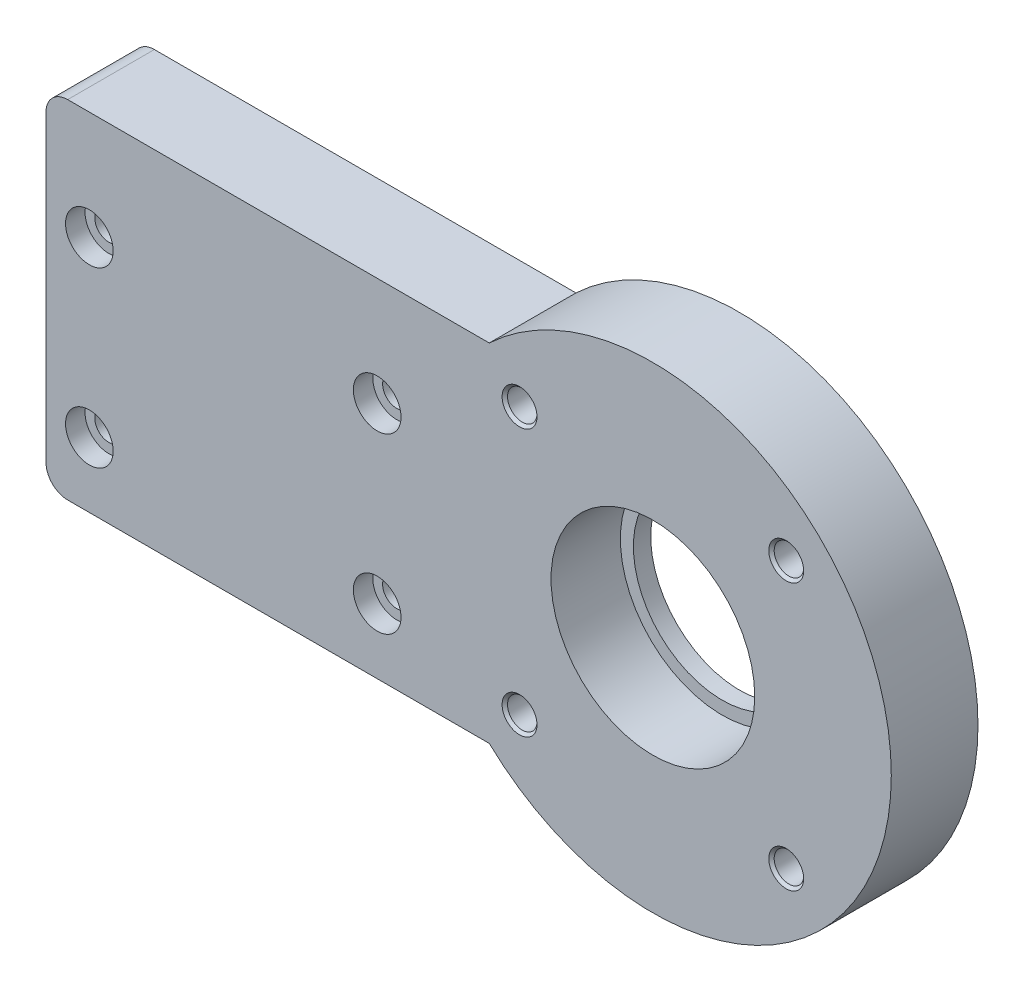
ISO-10303-21;
HEADER;
FILE_DESCRIPTION(('STEP AP214'),'2;1');
FILE_NAME('part.step','',(''),(''),'','','');
FILE_SCHEMA(('AUTOMOTIVE_DESIGN { 1 0 10303 214 1 1 1 1 }'));
ENDSEC;
DATA;
#1=APPLICATION_CONTEXT('core data for automotive mechanical design processes');
#2=APPLICATION_PROTOCOL_DEFINITION('international standard','automotive_design',2000,#1);
#3=PRODUCT_CONTEXT('',#1,'mechanical');
#4=PRODUCT('Part','Part','',(#3));
#5=PRODUCT_RELATED_PRODUCT_CATEGORY('part','',(#4));
#6=PRODUCT_DEFINITION_FORMATION('','',#4);
#7=PRODUCT_DEFINITION_CONTEXT('part definition',#1,'design');
#8=PRODUCT_DEFINITION('design','',#6,#7);
#9=PRODUCT_DEFINITION_SHAPE('','',#8);
#10=(LENGTH_UNIT() NAMED_UNIT(*) SI_UNIT(.MILLI.,.METRE.));
#11=(NAMED_UNIT(*) PLANE_ANGLE_UNIT() SI_UNIT($,.RADIAN.));
#12=(NAMED_UNIT(*) SI_UNIT($,.STERADIAN.) SOLID_ANGLE_UNIT());
#13=UNCERTAINTY_MEASURE_WITH_UNIT(LENGTH_MEASURE(1.E-05),#10,'distance_accuracy_value','');
#14=(GEOMETRIC_REPRESENTATION_CONTEXT(3) GLOBAL_UNCERTAINTY_ASSIGNED_CONTEXT((#13)) GLOBAL_UNIT_ASSIGNED_CONTEXT((#10,
#11,#12)) REPRESENTATION_CONTEXT('',''));
#15=CARTESIAN_POINT('',(0.,0.,0.));
#16=DIRECTION('',(0.,0.,1.));
#17=DIRECTION('',(1.,0.,0.));
#18=AXIS2_PLACEMENT_3D('',#15,#16,#17);
#19=CARTESIAN_POINT('',(-63.6,15.,-3.));
#20=DIRECTION('',(0.,0.,1.));
#21=DIRECTION('',(1.,0.,0.));
#22=AXIS2_PLACEMENT_3D('',#19,#20,#21);
#23=CYLINDRICAL_SURFACE('',#22,3.25000000000001);
#24=CARTESIAN_POINT('',(-63.6,15.,-3.));
#25=DIRECTION('',(0.,0.,1.));
#26=DIRECTION('',(1.,0.,0.));
#27=AXIS2_PLACEMENT_3D('',#24,#25,#26);
#28=CIRCLE('',#27,3.25000000000001);
#29=CARTESIAN_POINT('',(-60.35,15.,-3.));
#30=VERTEX_POINT('',#29);
#31=EDGE_CURVE('E223',#30,#30,#28,.T.);
#32=ORIENTED_EDGE('',*,*,#31,.F.);
#33=EDGE_LOOP('',(#32));
#34=FACE_BOUND('',#33,.T.);
#35=CARTESIAN_POINT('',(-63.6,15.,15.5));
#36=DIRECTION('',(0.,0.,1.));
#37=DIRECTION('',(1.,0.,0.));
#38=AXIS2_PLACEMENT_3D('',#35,#36,#37);
#39=CIRCLE('',#38,3.25000000000001);
#40=CARTESIAN_POINT('',(-60.35,15.,15.5));
#41=VERTEX_POINT('',#40);
#42=EDGE_CURVE('E230',#41,#41,#39,.F.);
#43=ORIENTED_EDGE('',*,*,#42,.F.);
#44=EDGE_LOOP('',(#43));
#45=FACE_BOUND('',#44,.T.);
#46=ADVANCED_FACE('F38',(#34,#45),#23,.F.);
#47=CARTESIAN_POINT('',(-130.,15.,-3.));
#48=DIRECTION('',(0.,0.,1.));
#49=DIRECTION('',(1.,0.,0.));
#50=AXIS2_PLACEMENT_3D('',#47,#48,#49);
#51=CYLINDRICAL_SURFACE('',#50,3.25000000000001);
#52=CARTESIAN_POINT('',(-130.,15.,-3.));
#53=DIRECTION('',(0.,0.,1.));
#54=DIRECTION('',(1.,0.,0.));
#55=AXIS2_PLACEMENT_3D('',#52,#53,#54);
#56=CIRCLE('',#55,3.25000000000001);
#57=CARTESIAN_POINT('',(-126.75,15.,-3.));
#58=VERTEX_POINT('',#57);
#59=EDGE_CURVE('E220',#58,#58,#56,.T.);
#60=ORIENTED_EDGE('',*,*,#59,.F.);
#61=EDGE_LOOP('',(#60));
#62=FACE_BOUND('',#61,.T.);
#63=CARTESIAN_POINT('',(-130.,15.,15.5));
#64=DIRECTION('',(0.,0.,1.));
#65=DIRECTION('',(1.,0.,0.));
#66=AXIS2_PLACEMENT_3D('',#63,#64,#65);
#67=CIRCLE('',#66,3.25000000000001);
#68=CARTESIAN_POINT('',(-126.75,15.,15.5));
#69=VERTEX_POINT('',#68);
#70=EDGE_CURVE('E333',#69,#69,#67,.F.);
#71=ORIENTED_EDGE('',*,*,#70,.F.);
#72=EDGE_LOOP('',(#71));
#73=FACE_BOUND('',#72,.T.);
#74=ADVANCED_FACE('F387',(#62,#73),#51,.F.);
#75=CARTESIAN_POINT('',(-130.,-25.,-3.));
#76=DIRECTION('',(0.,0.,1.));
#77=DIRECTION('',(1.,0.,0.));
#78=AXIS2_PLACEMENT_3D('',#75,#76,#77);
#79=CYLINDRICAL_SURFACE('',#78,3.25000000000001);
#80=CARTESIAN_POINT('',(-130.,-25.,-3.));
#81=DIRECTION('',(0.,0.,1.));
#82=DIRECTION('',(1.,0.,0.));
#83=AXIS2_PLACEMENT_3D('',#80,#81,#82);
#84=CIRCLE('',#83,3.25000000000001);
#85=CARTESIAN_POINT('',(-126.75,-25.,-3.));
#86=VERTEX_POINT('',#85);
#87=EDGE_CURVE('E224',#86,#86,#84,.T.);
#88=ORIENTED_EDGE('',*,*,#87,.F.);
#89=EDGE_LOOP('',(#88));
#90=FACE_BOUND('',#89,.T.);
#91=CARTESIAN_POINT('',(-130.,-25.,15.5));
#92=DIRECTION('',(0.,0.,1.));
#93=DIRECTION('',(1.,0.,0.));
#94=AXIS2_PLACEMENT_3D('',#91,#92,#93);
#95=CIRCLE('',#94,3.25000000000001);
#96=CARTESIAN_POINT('',(-126.75,-25.,15.5));
#97=VERTEX_POINT('',#96);
#98=EDGE_CURVE('E330',#97,#97,#95,.F.);
#99=ORIENTED_EDGE('',*,*,#98,.F.);
#100=EDGE_LOOP('',(#99));
#101=FACE_BOUND('',#100,.T.);
#102=ADVANCED_FACE('F393',(#90,#101),#79,.F.);
#103=CARTESIAN_POINT('',(-63.6,-25.,-3.));
#104=DIRECTION('',(0.,0.,1.));
#105=DIRECTION('',(1.,0.,0.));
#106=AXIS2_PLACEMENT_3D('',#103,#104,#105);
#107=CYLINDRICAL_SURFACE('',#106,3.25000000000001);
#108=CARTESIAN_POINT('',(-63.6,-25.,-3.));
#109=DIRECTION('',(0.,0.,1.));
#110=DIRECTION('',(1.,0.,0.));
#111=AXIS2_PLACEMENT_3D('',#108,#109,#110);
#112=CIRCLE('',#111,3.25000000000001);
#113=CARTESIAN_POINT('',(-60.35,-25.,-3.));
#114=VERTEX_POINT('',#113);
#115=EDGE_CURVE('E227',#114,#114,#112,.T.);
#116=ORIENTED_EDGE('',*,*,#115,.F.);
#117=EDGE_LOOP('',(#116));
#118=FACE_BOUND('',#117,.T.);
#119=CARTESIAN_POINT('',(-63.6,-25.,15.5));
#120=DIRECTION('',(0.,0.,1.));
#121=DIRECTION('',(1.,0.,0.));
#122=AXIS2_PLACEMENT_3D('',#119,#120,#121);
#123=CIRCLE('',#122,3.25000000000001);
#124=CARTESIAN_POINT('',(-60.35,-25.,15.5));
#125=VERTEX_POINT('',#124);
#126=EDGE_CURVE('E217',#125,#125,#123,.F.);
#127=ORIENTED_EDGE('',*,*,#126,.F.);
#128=EDGE_LOOP('',(#127));
#129=FACE_BOUND('',#128,.T.);
#130=ADVANCED_FACE('F400',(#118,#129),#107,.F.);
#131=CARTESIAN_POINT('',(0.,0.,0.));
#132=DIRECTION('',(0.,0.,1.));
#133=DIRECTION('',(1.,0.,0.));
#134=AXIS2_PLACEMENT_3D('',#131,#132,#133);
#135=PLANE('',#134);
#136=CARTESIAN_POINT('',(0.,0.,0.));
#137=DIRECTION('',(0.,0.,1.));
#138=DIRECTION('',(1.,0.,0.));
#139=AXIS2_PLACEMENT_3D('',#136,#137,#138);
#140=CIRCLE('',#139,20.5);
#141=CARTESIAN_POINT('',(20.5,0.,0.));
#142=VERTEX_POINT('',#141);
#143=EDGE_CURVE('E305',#142,#142,#140,.T.);
#144=ORIENTED_EDGE('',*,*,#143,.T.);
#145=EDGE_LOOP('',(#144));
#146=FACE_BOUND('',#145,.T.);
#147=DIRECTION('',(0.,-1.,0.));
#148=VECTOR('',#147,1.);
#149=CARTESIAN_POINT('',(-140.,40.,0.));
#150=LINE('',#149,#148);
#151=CARTESIAN_POINT('',(-140.,35.,0.));
#152=VERTEX_POINT('',#151);
#153=CARTESIAN_POINT('',(-140.,19.,0.));
#154=VERTEX_POINT('',#153);
#155=EDGE_CURVE('E319',#152,#154,#150,.T.);
#156=ORIENTED_EDGE('',*,*,#155,.F.);
#157=CARTESIAN_POINT('',(-135.,35.,0.));
#158=DIRECTION('',(0.,0.,1.));
#159=DIRECTION('',(1.,0.,0.));
#160=AXIS2_PLACEMENT_3D('',#157,#158,#159);
#161=CIRCLE('',#160,5.);
#162=CARTESIAN_POINT('',(-135.,40.,0.));
#163=VERTEX_POINT('',#162);
#164=EDGE_CURVE('E344',#152,#163,#161,.F.);
#165=ORIENTED_EDGE('',*,*,#164,.T.);
#166=DIRECTION('',(-1.,0.,0.));
#167=VECTOR('',#166,1.);
#168=CARTESIAN_POINT('',(0.,40.,0.));
#169=LINE('',#168,#167);
#170=CARTESIAN_POINT('',(-37.7491721763537,40.,0.));
#171=VERTEX_POINT('',#170);
#172=EDGE_CURVE('E308',#171,#163,#169,.T.);
#173=ORIENTED_EDGE('',*,*,#172,.F.);
#174=CARTESIAN_POINT('',(0.,0.,0.));
#175=DIRECTION('',(0.,0.,1.));
#176=DIRECTION('',(1.,0.,0.));
#177=AXIS2_PLACEMENT_3D('',#174,#175,#176);
#178=CIRCLE('',#177,55.);
#179=CARTESIAN_POINT('',(-37.7491721763537,-40.,0.));
#180=VERTEX_POINT('',#179);
#181=EDGE_CURVE('E297',#171,#180,#178,.F.);
#182=ORIENTED_EDGE('',*,*,#181,.T.);
#183=DIRECTION('',(1.,0.,0.));
#184=VECTOR('',#183,1.);
#185=CARTESIAN_POINT('',(-140.,-40.,0.));
#186=LINE('',#185,#184);
#187=CARTESIAN_POINT('',(-135.,-40.,0.));
#188=VERTEX_POINT('',#187);
#189=EDGE_CURVE('E312',#188,#180,#186,.T.);
#190=ORIENTED_EDGE('',*,*,#189,.F.);
#191=CARTESIAN_POINT('',(-135.,-35.,0.));
#192=DIRECTION('',(0.,0.,1.));
#193=DIRECTION('',(1.,0.,0.));
#194=AXIS2_PLACEMENT_3D('',#191,#192,#193);
#195=CIRCLE('',#194,5.);
#196=CARTESIAN_POINT('',(-140.,-35.,0.));
#197=VERTEX_POINT('',#196);
#198=EDGE_CURVE('E342',#188,#197,#195,.F.);
#199=ORIENTED_EDGE('',*,*,#198,.T.);
#200=CARTESIAN_POINT('',(-140.,-29.,0.));
#201=VERTEX_POINT('',#200);
#202=EDGE_CURVE('E318',#201,#197,#150,.T.);
#203=ORIENTED_EDGE('',*,*,#202,.F.);
#204=DIRECTION('',(-1.,0.,0.));
#205=VECTOR('',#204,1.);
#206=CARTESIAN_POINT('',(-140.,-29.,0.));
#207=LINE('',#206,#205);
#208=CARTESIAN_POINT('',(-55.,-29.,0.));
#209=VERTEX_POINT('',#208);
#210=EDGE_CURVE('E265',#209,#201,#207,.T.);
#211=ORIENTED_EDGE('',*,*,#210,.F.);
#212=DIRECTION('',(0.,-1.,0.));
#213=VECTOR('',#212,1.);
#214=CARTESIAN_POINT('',(-55.,-29.,0.));
#215=LINE('',#214,#213);
#216=CARTESIAN_POINT('',(-55.,-21.,0.));
#217=VERTEX_POINT('',#216);
#218=EDGE_CURVE('E274',#217,#209,#215,.T.);
#219=ORIENTED_EDGE('',*,*,#218,.F.);
#220=DIRECTION('',(1.,0.,0.));
#221=VECTOR('',#220,1.);
#222=CARTESIAN_POINT('',(-140.,-21.,0.));
#223=LINE('',#222,#221);
#224=CARTESIAN_POINT('',(-140.,-21.,0.));
#225=VERTEX_POINT('',#224);
#226=EDGE_CURVE('E260',#225,#217,#223,.T.);
#227=ORIENTED_EDGE('',*,*,#226,.F.);
#228=CARTESIAN_POINT('',(-140.,11.,0.));
#229=VERTEX_POINT('',#228);
#230=EDGE_CURVE('E321',#229,#225,#150,.T.);
#231=ORIENTED_EDGE('',*,*,#230,.F.);
#232=DIRECTION('',(-1.,0.,0.));
#233=VECTOR('',#232,1.);
#234=CARTESIAN_POINT('',(-140.,11.,0.));
#235=LINE('',#234,#233);
#236=CARTESIAN_POINT('',(-55.,11.,0.));
#237=VERTEX_POINT('',#236);
#238=EDGE_CURVE('E238',#237,#229,#235,.T.);
#239=ORIENTED_EDGE('',*,*,#238,.F.);
#240=DIRECTION('',(0.,-1.,0.));
#241=VECTOR('',#240,1.);
#242=CARTESIAN_POINT('',(-55.,11.,0.));
#243=LINE('',#242,#241);
#244=CARTESIAN_POINT('',(-55.,19.,0.));
#245=VERTEX_POINT('',#244);
#246=EDGE_CURVE('E246',#245,#237,#243,.T.);
#247=ORIENTED_EDGE('',*,*,#246,.F.);
#248=DIRECTION('',(1.,0.,0.));
#249=VECTOR('',#248,1.);
#250=CARTESIAN_POINT('',(-140.,19.,0.));
#251=LINE('',#250,#249);
#252=EDGE_CURVE('E233',#154,#245,#251,.T.);
#253=ORIENTED_EDGE('',*,*,#252,.F.);
#254=EDGE_LOOP('',(#156,#165,#173,#182,#190,#199,#203,#211,#219,#227,#231,#239,#247,#253));
#255=FACE_BOUND('',#254,.T.);
#256=ADVANCED_FACE('F360',(#146,#255),#135,.F.);
#257=CARTESIAN_POINT('',(0.,0.,20.));
#258=DIRECTION('',(0.,0.,-1.));
#259=DIRECTION('',(-1.,0.,0.));
#260=AXIS2_PLACEMENT_3D('',#257,#258,#259);
#261=CYLINDRICAL_SURFACE('',#260,20.5);
#262=ORIENTED_EDGE('',*,*,#143,.F.);
#263=EDGE_LOOP('',(#262));
#264=FACE_BOUND('',#263,.T.);
#265=CARTESIAN_POINT('',(0.,0.,4.));
#266=DIRECTION('',(0.,0.,1.));
#267=DIRECTION('',(1.,0.,0.));
#268=AXIS2_PLACEMENT_3D('',#265,#266,#267);
#269=CIRCLE('',#268,20.5);
#270=CARTESIAN_POINT('',(20.5,0.,4.));
#271=VERTEX_POINT('',#270);
#272=EDGE_CURVE('E294',#271,#271,#269,.T.);
#273=ORIENTED_EDGE('',*,*,#272,.T.);
#274=EDGE_LOOP('',(#273));
#275=FACE_BOUND('',#274,.T.);
#276=ADVANCED_FACE('F445',(#264,#275),#261,.F.);
#277=CARTESIAN_POINT('',(0.,0.,20.));
#278=DIRECTION('',(0.,0.,1.));
#279=DIRECTION('',(1.,0.,0.));
#280=AXIS2_PLACEMENT_3D('',#277,#278,#279);
#281=PLANE('',#280);
#282=CARTESIAN_POINT('',(30.7591449816149,30.7591449816148,20.));
#283=DIRECTION('',(0.,0.,1.));
#284=DIRECTION('',(1.,0.,0.));
#285=AXIS2_PLACEMENT_3D('',#282,#283,#284);
#286=CIRCLE('',#285,4.025);
#287=CARTESIAN_POINT('',(34.7841449816149,30.7591449816148,20.));
#288=VERTEX_POINT('',#287);
#289=EDGE_CURVE('E168',#288,#288,#286,.T.);
#290=ORIENTED_EDGE('',*,*,#289,.F.);
#291=EDGE_LOOP('',(#290));
#292=FACE_BOUND('',#291,.T.);
#293=CARTESIAN_POINT('',(-30.7591449816149,30.7591449816147,20.));
#294=DIRECTION('',(0.,0.,1.));
#295=DIRECTION('',(1.,0.,0.));
#296=AXIS2_PLACEMENT_3D('',#293,#294,#295);
#297=CIRCLE('',#296,4.025);
#298=CARTESIAN_POINT('',(-26.7341449816149,30.7591449816147,20.));
#299=VERTEX_POINT('',#298);
#300=EDGE_CURVE('E161',#299,#299,#297,.T.);
#301=ORIENTED_EDGE('',*,*,#300,.F.);
#302=EDGE_LOOP('',(#301));
#303=FACE_BOUND('',#302,.T.);
#304=CARTESIAN_POINT('',(-30.7591449816149,-30.7591449816148,20.));
#305=DIRECTION('',(0.,0.,1.));
#306=DIRECTION('',(1.,0.,0.));
#307=AXIS2_PLACEMENT_3D('',#304,#305,#306);
#308=CIRCLE('',#307,4.025);
#309=CARTESIAN_POINT('',(-26.7341449816149,-30.7591449816148,20.));
#310=VERTEX_POINT('',#309);
#311=EDGE_CURVE('E177',#310,#310,#308,.T.);
#312=ORIENTED_EDGE('',*,*,#311,.F.);
#313=EDGE_LOOP('',(#312));
#314=FACE_BOUND('',#313,.T.);
#315=CARTESIAN_POINT('',(30.7591449816149,-30.7591449816148,20.));
#316=DIRECTION('',(0.,0.,1.));
#317=DIRECTION('',(1.,0.,0.));
#318=AXIS2_PLACEMENT_3D('',#315,#316,#317);
#319=CIRCLE('',#318,4.025);
#320=CARTESIAN_POINT('',(34.7841449816149,-30.7591449816148,20.));
#321=VERTEX_POINT('',#320);
#322=EDGE_CURVE('E186',#321,#321,#319,.T.);
#323=ORIENTED_EDGE('',*,*,#322,.F.);
#324=EDGE_LOOP('',(#323));
#325=FACE_BOUND('',#324,.T.);
#326=CARTESIAN_POINT('',(-130.,-25.,20.));
#327=DIRECTION('',(0.,0.,1.));
#328=DIRECTION('',(1.,0.,0.));
#329=AXIS2_PLACEMENT_3D('',#326,#327,#328);
#330=CIRCLE('',#329,5.5);
#331=CARTESIAN_POINT('',(-124.5,-25.,20.));
#332=VERTEX_POINT('',#331);
#333=EDGE_CURVE('E195',#332,#332,#330,.T.);
#334=ORIENTED_EDGE('',*,*,#333,.F.);
#335=EDGE_LOOP('',(#334));
#336=FACE_BOUND('',#335,.T.);
#337=CARTESIAN_POINT('',(-63.6,-25.,20.));
#338=DIRECTION('',(0.,0.,1.));
#339=DIRECTION('',(1.,0.,0.));
#340=AXIS2_PLACEMENT_3D('',#337,#338,#339);
#341=CIRCLE('',#340,5.49999999999999);
#342=CARTESIAN_POINT('',(-58.1,-25.,20.));
#343=VERTEX_POINT('',#342);
#344=EDGE_CURVE('E206',#343,#343,#341,.T.);
#345=ORIENTED_EDGE('',*,*,#344,.F.);
#346=EDGE_LOOP('',(#345));
#347=FACE_BOUND('',#346,.T.);
#348=CARTESIAN_POINT('',(-63.6,15.,20.));
#349=DIRECTION('',(0.,0.,1.));
#350=DIRECTION('',(1.,0.,0.));
#351=AXIS2_PLACEMENT_3D('',#348,#349,#350);
#352=CIRCLE('',#351,5.49999999999999);
#353=CARTESIAN_POINT('',(-58.1,15.,20.));
#354=VERTEX_POINT('',#353);
#355=EDGE_CURVE('E200',#354,#354,#352,.T.);
#356=ORIENTED_EDGE('',*,*,#355,.F.);
#357=EDGE_LOOP('',(#356));
#358=FACE_BOUND('',#357,.T.);
#359=CARTESIAN_POINT('',(-130.,15.,20.));
#360=DIRECTION('',(0.,0.,1.));
#361=DIRECTION('',(1.,0.,0.));
#362=AXIS2_PLACEMENT_3D('',#359,#360,#361);
#363=CIRCLE('',#362,5.5);
#364=CARTESIAN_POINT('',(-124.5,15.,20.));
#365=VERTEX_POINT('',#364);
#366=EDGE_CURVE('E199',#365,#365,#363,.T.);
#367=ORIENTED_EDGE('',*,*,#366,.F.);
#368=EDGE_LOOP('',(#367));
#369=FACE_BOUND('',#368,.T.);
#370=CARTESIAN_POINT('',(0.,0.,20.));
#371=DIRECTION('',(0.,0.,1.));
#372=DIRECTION('',(1.,0.,0.));
#373=AXIS2_PLACEMENT_3D('',#370,#371,#372);
#374=CIRCLE('',#373,23.5);
#375=CARTESIAN_POINT('',(23.5,0.,20.));
#376=VERTEX_POINT('',#375);
#377=EDGE_CURVE('E290',#376,#376,#374,.T.);
#378=ORIENTED_EDGE('',*,*,#377,.F.);
#379=EDGE_LOOP('',(#378));
#380=FACE_BOUND('',#379,.T.);
#381=DIRECTION('',(-1.,0.,0.));
#382=VECTOR('',#381,1.);
#383=CARTESIAN_POINT('',(0.,40.,20.));
#384=LINE('',#383,#382);
#385=CARTESIAN_POINT('',(-37.7491721763537,40.,20.));
#386=VERTEX_POINT('',#385);
#387=CARTESIAN_POINT('',(-135.,40.,20.));
#388=VERTEX_POINT('',#387);
#389=EDGE_CURVE('E309',#386,#388,#384,.T.);
#390=ORIENTED_EDGE('',*,*,#389,.T.);
#391=CARTESIAN_POINT('',(-135.,35.,20.));
#392=DIRECTION('',(0.,0.,1.));
#393=DIRECTION('',(1.,0.,0.));
#394=AXIS2_PLACEMENT_3D('',#391,#392,#393);
#395=CIRCLE('',#394,5.);
#396=CARTESIAN_POINT('',(-140.,35.,20.));
#397=VERTEX_POINT('',#396);
#398=EDGE_CURVE('E46',#388,#397,#395,.T.);
#399=ORIENTED_EDGE('',*,*,#398,.T.);
#400=DIRECTION('',(0.,-1.,0.));
#401=VECTOR('',#400,1.);
#402=CARTESIAN_POINT('',(-140.,40.,20.));
#403=LINE('',#402,#401);
#404=CARTESIAN_POINT('',(-140.,-35.,20.));
#405=VERTEX_POINT('',#404);
#406=EDGE_CURVE('E311',#397,#405,#403,.T.);
#407=ORIENTED_EDGE('',*,*,#406,.T.);
#408=CARTESIAN_POINT('',(-135.,-35.,20.));
#409=DIRECTION('',(0.,0.,1.));
#410=DIRECTION('',(1.,0.,0.));
#411=AXIS2_PLACEMENT_3D('',#408,#409,#410);
#412=CIRCLE('',#411,5.);
#413=CARTESIAN_POINT('',(-135.,-40.,20.));
#414=VERTEX_POINT('',#413);
#415=EDGE_CURVE('E53',#405,#414,#412,.T.);
#416=ORIENTED_EDGE('',*,*,#415,.T.);
#417=DIRECTION('',(1.,0.,0.));
#418=VECTOR('',#417,1.);
#419=CARTESIAN_POINT('',(-140.,-40.,20.));
#420=LINE('',#419,#418);
#421=CARTESIAN_POINT('',(-37.7491721763537,-40.,20.));
#422=VERTEX_POINT('',#421);
#423=EDGE_CURVE('E314',#414,#422,#420,.T.);
#424=ORIENTED_EDGE('',*,*,#423,.T.);
#425=CARTESIAN_POINT('',(0.,0.,20.));
#426=DIRECTION('',(0.,0.,1.));
#427=DIRECTION('',(1.,0.,0.));
#428=AXIS2_PLACEMENT_3D('',#425,#426,#427);
#429=CIRCLE('',#428,55.);
#430=EDGE_CURVE('E301',#422,#386,#429,.T.);
#431=ORIENTED_EDGE('',*,*,#430,.T.);
#432=EDGE_LOOP('',(#390,#399,#407,#416,#424,#431));
#433=FACE_BOUND('',#432,.T.);
#434=ADVANCED_FACE('F349',(#292,#303,#314,#325,#336,#347,#358,#369,#380,#433),#281,.T.);
#435=CARTESIAN_POINT('',(0.,40.,20.));
#436=DIRECTION('',(0.,-1.,0.));
#437=DIRECTION('',(0.,0.,-1.));
#438=AXIS2_PLACEMENT_3D('',#435,#436,#437);
#439=PLANE('',#438);
#440=ORIENTED_EDGE('',*,*,#172,.T.);
#441=DIRECTION('',(0.,0.,-1.));
#442=VECTOR('',#441,1.);
#443=CARTESIAN_POINT('',(-135.,40.,20.));
#444=LINE('',#443,#442);
#445=EDGE_CURVE('E61',#163,#388,#444,.F.);
#446=ORIENTED_EDGE('',*,*,#445,.T.);
#447=ORIENTED_EDGE('',*,*,#389,.F.);
#448=DIRECTION('',(0.,0.,1.));
#449=VECTOR('',#448,1.);
#450=CARTESIAN_POINT('',(-37.7491721763537,40.,-155.56349186104));
#451=LINE('',#450,#449);
#452=EDGE_CURVE('E300',#386,#171,#451,.F.);
#453=ORIENTED_EDGE('',*,*,#452,.T.);
#454=EDGE_LOOP('',(#440,#446,#447,#453));
#455=FACE_BOUND('',#454,.T.);
#456=ADVANCED_FACE('F363',(#455),#439,.F.);
#457=CARTESIAN_POINT('',(-140.,40.,20.));
#458=DIRECTION('',(1.,0.,0.));
#459=DIRECTION('',(0.,0.,-1.));
#460=AXIS2_PLACEMENT_3D('',#457,#458,#459);
#461=PLANE('',#460);
#462=ORIENTED_EDGE('',*,*,#406,.F.);
#463=DIRECTION('',(0.,0.,-1.));
#464=VECTOR('',#463,1.);
#465=CARTESIAN_POINT('',(-140.,35.,20.));
#466=LINE('',#465,#464);
#467=EDGE_CURVE('E339',#397,#152,#466,.T.);
#468=ORIENTED_EDGE('',*,*,#467,.T.);
#469=ORIENTED_EDGE('',*,*,#155,.T.);
#470=DIRECTION('',(0.,0.,1.));
#471=VECTOR('',#470,1.);
#472=CARTESIAN_POINT('',(-140.,19.,-3.));
#473=LINE('',#472,#471);
#474=CARTESIAN_POINT('',(-140.,19.,-3.));
#475=VERTEX_POINT('',#474);
#476=EDGE_CURVE('E257',#475,#154,#473,.T.);
#477=ORIENTED_EDGE('',*,*,#476,.F.);
#478=DIRECTION('',(0.,1.,0.));
#479=VECTOR('',#478,1.);
#480=CARTESIAN_POINT('',(-140.,11.,-3.));
#481=LINE('',#480,#479);
#482=CARTESIAN_POINT('',(-140.,11.,-3.));
#483=VERTEX_POINT('',#482);
#484=EDGE_CURVE('E234',#483,#475,#481,.T.);
#485=ORIENTED_EDGE('',*,*,#484,.F.);
#486=DIRECTION('',(0.,0.,1.));
#487=VECTOR('',#486,1.);
#488=CARTESIAN_POINT('',(-140.,11.,-3.));
#489=LINE('',#488,#487);
#490=EDGE_CURVE('E244',#483,#229,#489,.T.);
#491=ORIENTED_EDGE('',*,*,#490,.T.);
#492=ORIENTED_EDGE('',*,*,#230,.T.);
#493=DIRECTION('',(0.,0.,1.));
#494=VECTOR('',#493,1.);
#495=CARTESIAN_POINT('',(-140.,-21.,-3.));
#496=LINE('',#495,#494);
#497=CARTESIAN_POINT('',(-140.,-21.,-3.));
#498=VERTEX_POINT('',#497);
#499=EDGE_CURVE('E287',#498,#225,#496,.T.);
#500=ORIENTED_EDGE('',*,*,#499,.F.);
#501=DIRECTION('',(0.,1.,0.));
#502=VECTOR('',#501,1.);
#503=CARTESIAN_POINT('',(-140.,-29.,-3.));
#504=LINE('',#503,#502);
#505=CARTESIAN_POINT('',(-140.,-29.,-3.));
#506=VERTEX_POINT('',#505);
#507=EDGE_CURVE('E261',#506,#498,#504,.T.);
#508=ORIENTED_EDGE('',*,*,#507,.F.);
#509=DIRECTION('',(0.,0.,1.));
#510=VECTOR('',#509,1.);
#511=CARTESIAN_POINT('',(-140.,-29.,-3.));
#512=LINE('',#511,#510);
#513=EDGE_CURVE('E271',#506,#201,#512,.T.);
#514=ORIENTED_EDGE('',*,*,#513,.T.);
#515=ORIENTED_EDGE('',*,*,#202,.T.);
#516=DIRECTION('',(0.,0.,-1.));
#517=VECTOR('',#516,1.);
#518=CARTESIAN_POINT('',(-140.,-35.,20.));
#519=LINE('',#518,#517);
#520=EDGE_CURVE('E325',#197,#405,#519,.F.);
#521=ORIENTED_EDGE('',*,*,#520,.T.);
#522=EDGE_LOOP('',(#462,#468,#469,#477,#485,#491,#492,#500,#508,#514,#515,#521));
#523=FACE_BOUND('',#522,.T.);
#524=ADVANCED_FACE('F353',(#523),#461,.F.);
#525=CARTESIAN_POINT('',(-140.,-40.,20.));
#526=DIRECTION('',(0.,1.,0.));
#527=DIRECTION('',(0.,0.,1.));
#528=AXIS2_PLACEMENT_3D('',#525,#526,#527);
#529=PLANE('',#528);
#530=ORIENTED_EDGE('',*,*,#423,.F.);
#531=DIRECTION('',(0.,0.,-1.));
#532=VECTOR('',#531,1.);
#533=CARTESIAN_POINT('',(-135.,-40.,20.));
#534=LINE('',#533,#532);
#535=EDGE_CURVE('E11',#414,#188,#534,.T.);
#536=ORIENTED_EDGE('',*,*,#535,.T.);
#537=ORIENTED_EDGE('',*,*,#189,.T.);
#538=DIRECTION('',(0.,0.,1.));
#539=VECTOR('',#538,1.);
#540=CARTESIAN_POINT('',(-37.7491721763537,-40.,-155.56349186104));
#541=LINE('',#540,#539);
#542=EDGE_CURVE('E316',#180,#422,#541,.T.);
#543=ORIENTED_EDGE('',*,*,#542,.T.);
#544=EDGE_LOOP('',(#530,#536,#537,#543));
#545=FACE_BOUND('',#544,.T.);
#546=ADVANCED_FACE('F371',(#545),#529,.F.);
#547=CARTESIAN_POINT('',(0.,0.,-155.56349186104));
#548=DIRECTION('',(0.,0.,1.));
#549=DIRECTION('',(1.,0.,0.));
#550=AXIS2_PLACEMENT_3D('',#547,#548,#549);
#551=CYLINDRICAL_SURFACE('',#550,55.);
#552=ORIENTED_EDGE('',*,*,#452,.F.);
#553=ORIENTED_EDGE('',*,*,#430,.F.);
#554=ORIENTED_EDGE('',*,*,#542,.F.);
#555=ORIENTED_EDGE('',*,*,#181,.F.);
#556=EDGE_LOOP('',(#552,#553,#554,#555));
#557=FACE_BOUND('',#556,.T.);
#558=ADVANCED_FACE('F367',(#557),#551,.T.);
#559=CARTESIAN_POINT('',(0.,0.,4.));
#560=DIRECTION('',(0.,0.,1.));
#561=DIRECTION('',(1.,0.,0.));
#562=AXIS2_PLACEMENT_3D('',#559,#560,#561);
#563=CYLINDRICAL_SURFACE('',#562,23.5);
#564=CARTESIAN_POINT('',(0.,0.,4.));
#565=DIRECTION('',(0.,0.,1.));
#566=DIRECTION('',(1.,0.,0.));
#567=AXIS2_PLACEMENT_3D('',#564,#565,#566);
#568=CIRCLE('',#567,23.5);
#569=CARTESIAN_POINT('',(23.5,0.,4.));
#570=VERTEX_POINT('',#569);
#571=EDGE_CURVE('E291',#570,#570,#568,.T.);
#572=ORIENTED_EDGE('',*,*,#571,.F.);
#573=EDGE_LOOP('',(#572));
#574=FACE_BOUND('',#573,.T.);
#575=ORIENTED_EDGE('',*,*,#377,.T.);
#576=EDGE_LOOP('',(#575));
#577=FACE_BOUND('',#576,.T.);
#578=ADVANCED_FACE('F438',(#574,#577),#563,.F.);
#579=CARTESIAN_POINT('',(0.,0.,4.));
#580=DIRECTION('',(0.,0.,1.));
#581=DIRECTION('',(1.,0.,0.));
#582=AXIS2_PLACEMENT_3D('',#579,#580,#581);
#583=PLANE('',#582);
#584=ORIENTED_EDGE('',*,*,#272,.F.);
#585=EDGE_LOOP('',(#584));
#586=FACE_BOUND('',#585,.T.);
#587=ORIENTED_EDGE('',*,*,#571,.T.);
#588=EDGE_LOOP('',(#587));
#589=FACE_BOUND('',#588,.T.);
#590=ADVANCED_FACE('F434',(#586,#589),#583,.T.);
#591=CARTESIAN_POINT('',(-140.,-21.,-3.));
#592=DIRECTION('',(0.,-1.,0.));
#593=DIRECTION('',(0.,0.,-1.));
#594=AXIS2_PLACEMENT_3D('',#591,#592,#593);
#595=PLANE('',#594);
#596=ORIENTED_EDGE('',*,*,#226,.T.);
#597=DIRECTION('',(0.,0.,1.));
#598=VECTOR('',#597,1.);
#599=CARTESIAN_POINT('',(-55.,-21.,-3.));
#600=LINE('',#599,#598);
#601=CARTESIAN_POINT('',(-55.,-21.,-3.));
#602=VERTEX_POINT('',#601);
#603=EDGE_CURVE('E284',#602,#217,#600,.T.);
#604=ORIENTED_EDGE('',*,*,#603,.F.);
#605=DIRECTION('',(1.,0.,0.));
#606=VECTOR('',#605,1.);
#607=CARTESIAN_POINT('',(-140.,-21.,-3.));
#608=LINE('',#607,#606);
#609=EDGE_CURVE('E264',#498,#602,#608,.T.);
#610=ORIENTED_EDGE('',*,*,#609,.F.);
#611=ORIENTED_EDGE('',*,*,#499,.T.);
#612=EDGE_LOOP('',(#596,#604,#610,#611));
#613=FACE_BOUND('',#612,.T.);
#614=ADVANCED_FACE('F430',(#613),#595,.F.);
#615=CARTESIAN_POINT('',(-55.,-29.,-3.));
#616=DIRECTION('',(-1.,0.,0.));
#617=DIRECTION('',(0.,0.,1.));
#618=AXIS2_PLACEMENT_3D('',#615,#616,#617);
#619=PLANE('',#618);
#620=ORIENTED_EDGE('',*,*,#218,.T.);
#621=DIRECTION('',(0.,0.,1.));
#622=VECTOR('',#621,1.);
#623=CARTESIAN_POINT('',(-55.,-29.,-3.));
#624=LINE('',#623,#622);
#625=CARTESIAN_POINT('',(-55.,-29.,-3.));
#626=VERTEX_POINT('',#625);
#627=EDGE_CURVE('E281',#626,#209,#624,.T.);
#628=ORIENTED_EDGE('',*,*,#627,.F.);
#629=DIRECTION('',(0.,-1.,0.));
#630=VECTOR('',#629,1.);
#631=CARTESIAN_POINT('',(-55.,-29.,-3.));
#632=LINE('',#631,#630);
#633=EDGE_CURVE('E267',#602,#626,#632,.T.);
#634=ORIENTED_EDGE('',*,*,#633,.F.);
#635=ORIENTED_EDGE('',*,*,#603,.T.);
#636=EDGE_LOOP('',(#620,#628,#634,#635));
#637=FACE_BOUND('',#636,.T.);
#638=ADVANCED_FACE('F426',(#637),#619,.F.);
#639=CARTESIAN_POINT('',(-140.,-29.,-3.));
#640=DIRECTION('',(0.,1.,0.));
#641=DIRECTION('',(-1.,0.,0.));
#642=AXIS2_PLACEMENT_3D('',#639,#640,#641);
#643=PLANE('',#642);
#644=ORIENTED_EDGE('',*,*,#210,.T.);
#645=ORIENTED_EDGE('',*,*,#513,.F.);
#646=DIRECTION('',(-1.,0.,0.));
#647=VECTOR('',#646,1.);
#648=CARTESIAN_POINT('',(-140.,-29.,-3.));
#649=LINE('',#648,#647);
#650=EDGE_CURVE('E269',#626,#506,#649,.T.);
#651=ORIENTED_EDGE('',*,*,#650,.F.);
#652=ORIENTED_EDGE('',*,*,#627,.T.);
#653=EDGE_LOOP('',(#644,#645,#651,#652));
#654=FACE_BOUND('',#653,.T.);
#655=ADVANCED_FACE('F422',(#654),#643,.F.);
#656=CARTESIAN_POINT('',(0.,0.,-3.));
#657=DIRECTION('',(0.,0.,-1.));
#658=DIRECTION('',(-1.,0.,0.));
#659=AXIS2_PLACEMENT_3D('',#656,#657,#658);
#660=PLANE('',#659);
#661=ORIENTED_EDGE('',*,*,#115,.T.);
#662=EDGE_LOOP('',(#661));
#663=FACE_BOUND('',#662,.T.);
#664=ORIENTED_EDGE('',*,*,#87,.T.);
#665=EDGE_LOOP('',(#664));
#666=FACE_BOUND('',#665,.T.);
#667=ORIENTED_EDGE('',*,*,#507,.T.);
#668=ORIENTED_EDGE('',*,*,#609,.T.);
#669=ORIENTED_EDGE('',*,*,#633,.T.);
#670=ORIENTED_EDGE('',*,*,#650,.T.);
#671=EDGE_LOOP('',(#667,#668,#669,#670));
#672=FACE_BOUND('',#671,.T.);
#673=ADVANCED_FACE('F418',(#663,#666,#672),#660,.T.);
#674=CARTESIAN_POINT('',(-140.,19.,-3.));
#675=DIRECTION('',(0.,-1.,0.));
#676=DIRECTION('',(1.,0.,0.));
#677=AXIS2_PLACEMENT_3D('',#674,#675,#676);
#678=PLANE('',#677);
#679=ORIENTED_EDGE('',*,*,#252,.T.);
#680=DIRECTION('',(0.,0.,1.));
#681=VECTOR('',#680,1.);
#682=CARTESIAN_POINT('',(-55.,19.,-3.));
#683=LINE('',#682,#681);
#684=CARTESIAN_POINT('',(-55.,19.,-3.));
#685=VERTEX_POINT('',#684);
#686=EDGE_CURVE('E254',#685,#245,#683,.T.);
#687=ORIENTED_EDGE('',*,*,#686,.F.);
#688=DIRECTION('',(1.,0.,0.));
#689=VECTOR('',#688,1.);
#690=CARTESIAN_POINT('',(-140.,19.,-3.));
#691=LINE('',#690,#689);
#692=EDGE_CURVE('E237',#475,#685,#691,.T.);
#693=ORIENTED_EDGE('',*,*,#692,.F.);
#694=ORIENTED_EDGE('',*,*,#476,.T.);
#695=EDGE_LOOP('',(#679,#687,#693,#694));
#696=FACE_BOUND('',#695,.T.);
#697=ADVANCED_FACE('F414',(#696),#678,.F.);
#698=CARTESIAN_POINT('',(-55.,11.,-3.));
#699=DIRECTION('',(-1.,0.,0.));
#700=DIRECTION('',(0.,0.,1.));
#701=AXIS2_PLACEMENT_3D('',#698,#699,#700);
#702=PLANE('',#701);
#703=ORIENTED_EDGE('',*,*,#246,.T.);
#704=DIRECTION('',(0.,0.,1.));
#705=VECTOR('',#704,1.);
#706=CARTESIAN_POINT('',(-55.,11.,-3.));
#707=LINE('',#706,#705);
#708=CARTESIAN_POINT('',(-55.,11.,-3.));
#709=VERTEX_POINT('',#708);
#710=EDGE_CURVE('E251',#709,#237,#707,.T.);
#711=ORIENTED_EDGE('',*,*,#710,.F.);
#712=DIRECTION('',(0.,-1.,0.));
#713=VECTOR('',#712,1.);
#714=CARTESIAN_POINT('',(-55.,11.,-3.));
#715=LINE('',#714,#713);
#716=EDGE_CURVE('E240',#685,#709,#715,.T.);
#717=ORIENTED_EDGE('',*,*,#716,.F.);
#718=ORIENTED_EDGE('',*,*,#686,.T.);
#719=EDGE_LOOP('',(#703,#711,#717,#718));
#720=FACE_BOUND('',#719,.T.);
#721=ADVANCED_FACE('F410',(#720),#702,.F.);
#722=CARTESIAN_POINT('',(-140.,11.,-3.));
#723=DIRECTION('',(0.,1.,0.));
#724=DIRECTION('',(-1.,0.,0.));
#725=AXIS2_PLACEMENT_3D('',#722,#723,#724);
#726=PLANE('',#725);
#727=ORIENTED_EDGE('',*,*,#238,.T.);
#728=ORIENTED_EDGE('',*,*,#490,.F.);
#729=DIRECTION('',(-1.,0.,0.));
#730=VECTOR('',#729,1.);
#731=CARTESIAN_POINT('',(-140.,11.,-3.));
#732=LINE('',#731,#730);
#733=EDGE_CURVE('E242',#709,#483,#732,.T.);
#734=ORIENTED_EDGE('',*,*,#733,.F.);
#735=ORIENTED_EDGE('',*,*,#710,.T.);
#736=EDGE_LOOP('',(#727,#728,#734,#735));
#737=FACE_BOUND('',#736,.T.);
#738=ADVANCED_FACE('F406',(#737),#726,.F.);
#739=CARTESIAN_POINT('',(0.,0.,-3.));
#740=DIRECTION('',(0.,0.,-1.));
#741=DIRECTION('',(-1.,0.,0.));
#742=AXIS2_PLACEMENT_3D('',#739,#740,#741);
#743=PLANE('',#742);
#744=ORIENTED_EDGE('',*,*,#59,.T.);
#745=EDGE_LOOP('',(#744));
#746=FACE_BOUND('',#745,.T.);
#747=ORIENTED_EDGE('',*,*,#31,.T.);
#748=EDGE_LOOP('',(#747));
#749=FACE_BOUND('',#748,.T.);
#750=ORIENTED_EDGE('',*,*,#484,.T.);
#751=ORIENTED_EDGE('',*,*,#692,.T.);
#752=ORIENTED_EDGE('',*,*,#716,.T.);
#753=ORIENTED_EDGE('',*,*,#733,.T.);
#754=EDGE_LOOP('',(#750,#751,#752,#753));
#755=FACE_BOUND('',#754,.T.);
#756=ADVANCED_FACE('F402',(#746,#749,#755),#743,.T.);
#757=CARTESIAN_POINT('',(-63.6,-25.,15.5));
#758=DIRECTION('',(0.,0.,1.));
#759=DIRECTION('',(1.,0.,0.));
#760=AXIS2_PLACEMENT_3D('',#757,#758,#759);
#761=PLANE('',#760);
#762=CARTESIAN_POINT('',(-63.6,-25.,15.5));
#763=DIRECTION('',(0.,0.,1.));
#764=DIRECTION('',(1.,0.,0.));
#765=AXIS2_PLACEMENT_3D('',#762,#763,#764);
#766=CIRCLE('',#765,5.49999999999999);
#767=CARTESIAN_POINT('',(-58.1,-25.,15.5));
#768=VERTEX_POINT('',#767);
#769=EDGE_CURVE('E203',#768,#768,#766,.T.);
#770=ORIENTED_EDGE('',*,*,#769,.T.);
#771=EDGE_LOOP('',(#770));
#772=FACE_BOUND('',#771,.T.);
#773=ORIENTED_EDGE('',*,*,#126,.T.);
#774=EDGE_LOOP('',(#773));
#775=FACE_BOUND('',#774,.T.);
#776=ADVANCED_FACE('F405',(#772,#775),#761,.T.);
#777=CARTESIAN_POINT('',(-63.6,-25.,15.5));
#778=DIRECTION('',(0.,0.,1.));
#779=DIRECTION('',(1.,0.,0.));
#780=AXIS2_PLACEMENT_3D('',#777,#778,#779);
#781=CYLINDRICAL_SURFACE('',#780,5.49999999999999);
#782=ORIENTED_EDGE('',*,*,#769,.F.);
#783=EDGE_LOOP('',(#782));
#784=FACE_BOUND('',#783,.T.);
#785=ORIENTED_EDGE('',*,*,#344,.T.);
#786=EDGE_LOOP('',(#785));
#787=FACE_BOUND('',#786,.T.);
#788=ADVANCED_FACE('F525',(#784,#787),#781,.F.);
#789=CARTESIAN_POINT('',(-130.,-25.,15.5));
#790=DIRECTION('',(0.,0.,1.));
#791=DIRECTION('',(1.,0.,0.));
#792=AXIS2_PLACEMENT_3D('',#789,#790,#791);
#793=PLANE('',#792);
#794=CARTESIAN_POINT('',(-130.,-25.,15.5));
#795=DIRECTION('',(0.,0.,1.));
#796=DIRECTION('',(1.,0.,0.));
#797=AXIS2_PLACEMENT_3D('',#794,#795,#796);
#798=CIRCLE('',#797,5.5);
#799=CARTESIAN_POINT('',(-124.5,-25.,15.5));
#800=VERTEX_POINT('',#799);
#801=EDGE_CURVE('E209',#800,#800,#798,.T.);
#802=ORIENTED_EDGE('',*,*,#801,.T.);
#803=EDGE_LOOP('',(#802));
#804=FACE_BOUND('',#803,.T.);
#805=ORIENTED_EDGE('',*,*,#98,.T.);
#806=EDGE_LOOP('',(#805));
#807=FACE_BOUND('',#806,.T.);
#808=ADVANCED_FACE('F534',(#804,#807),#793,.T.);
#809=CARTESIAN_POINT('',(-130.,-25.,15.5));
#810=DIRECTION('',(0.,0.,1.));
#811=DIRECTION('',(1.,0.,0.));
#812=AXIS2_PLACEMENT_3D('',#809,#810,#811);
#813=CYLINDRICAL_SURFACE('',#812,5.5);
#814=ORIENTED_EDGE('',*,*,#801,.F.);
#815=EDGE_LOOP('',(#814));
#816=FACE_BOUND('',#815,.T.);
#817=ORIENTED_EDGE('',*,*,#333,.T.);
#818=EDGE_LOOP('',(#817));
#819=FACE_BOUND('',#818,.T.);
#820=ADVANCED_FACE('F542',(#816,#819),#813,.F.);
#821=CARTESIAN_POINT('',(-130.,15.,15.5));
#822=DIRECTION('',(0.,0.,1.));
#823=DIRECTION('',(1.,0.,0.));
#824=AXIS2_PLACEMENT_3D('',#821,#822,#823);
#825=PLANE('',#824);
#826=CARTESIAN_POINT('',(-130.,15.,15.5));
#827=DIRECTION('',(0.,0.,1.));
#828=DIRECTION('',(1.,0.,0.));
#829=AXIS2_PLACEMENT_3D('',#826,#827,#828);
#830=CIRCLE('',#829,5.5);
#831=CARTESIAN_POINT('',(-124.5,15.,15.5));
#832=VERTEX_POINT('',#831);
#833=EDGE_CURVE('E214',#832,#832,#830,.T.);
#834=ORIENTED_EDGE('',*,*,#833,.T.);
#835=EDGE_LOOP('',(#834));
#836=FACE_BOUND('',#835,.T.);
#837=ORIENTED_EDGE('',*,*,#70,.T.);
#838=EDGE_LOOP('',(#837));
#839=FACE_BOUND('',#838,.T.);
#840=ADVANCED_FACE('F550',(#836,#839),#825,.T.);
#841=CARTESIAN_POINT('',(-130.,15.,15.5));
#842=DIRECTION('',(0.,0.,1.));
#843=DIRECTION('',(1.,0.,0.));
#844=AXIS2_PLACEMENT_3D('',#841,#842,#843);
#845=CYLINDRICAL_SURFACE('',#844,5.5);
#846=ORIENTED_EDGE('',*,*,#833,.F.);
#847=EDGE_LOOP('',(#846));
#848=FACE_BOUND('',#847,.T.);
#849=ORIENTED_EDGE('',*,*,#366,.T.);
#850=EDGE_LOOP('',(#849));
#851=FACE_BOUND('',#850,.T.);
#852=ADVANCED_FACE('F558',(#848,#851),#845,.F.);
#853=CARTESIAN_POINT('',(-63.6,15.,15.5));
#854=DIRECTION('',(0.,0.,1.));
#855=DIRECTION('',(1.,0.,0.));
#856=AXIS2_PLACEMENT_3D('',#853,#854,#855);
#857=PLANE('',#856);
#858=CARTESIAN_POINT('',(-63.6,15.,15.5));
#859=DIRECTION('',(0.,0.,1.));
#860=DIRECTION('',(1.,0.,0.));
#861=AXIS2_PLACEMENT_3D('',#858,#859,#860);
#862=CIRCLE('',#861,5.49999999999999);
#863=CARTESIAN_POINT('',(-58.1,15.,15.5));
#864=VERTEX_POINT('',#863);
#865=EDGE_CURVE('E196',#864,#864,#862,.T.);
#866=ORIENTED_EDGE('',*,*,#865,.T.);
#867=EDGE_LOOP('',(#866));
#868=FACE_BOUND('',#867,.T.);
#869=ORIENTED_EDGE('',*,*,#42,.T.);
#870=EDGE_LOOP('',(#869));
#871=FACE_BOUND('',#870,.T.);
#872=ADVANCED_FACE('F566',(#868,#871),#857,.T.);
#873=CARTESIAN_POINT('',(-63.6,15.,15.5));
#874=DIRECTION('',(0.,0.,1.));
#875=DIRECTION('',(1.,0.,0.));
#876=AXIS2_PLACEMENT_3D('',#873,#874,#875);
#877=CYLINDRICAL_SURFACE('',#876,5.49999999999999);
#878=ORIENTED_EDGE('',*,*,#865,.F.);
#879=EDGE_LOOP('',(#878));
#880=FACE_BOUND('',#879,.T.);
#881=ORIENTED_EDGE('',*,*,#355,.T.);
#882=EDGE_LOOP('',(#881));
#883=FACE_BOUND('',#882,.T.);
#884=ADVANCED_FACE('F385',(#880,#883),#877,.F.);
#885=CARTESIAN_POINT('',(-135.,35.,20.));
#886=DIRECTION('',(0.,0.,-1.));
#887=DIRECTION('',(-1.,0.,0.));
#888=AXIS2_PLACEMENT_3D('',#885,#886,#887);
#889=CYLINDRICAL_SURFACE('',#888,5.);
#890=ORIENTED_EDGE('',*,*,#398,.F.);
#891=ORIENTED_EDGE('',*,*,#445,.F.);
#892=ORIENTED_EDGE('',*,*,#164,.F.);
#893=ORIENTED_EDGE('',*,*,#467,.F.);
#894=EDGE_LOOP('',(#890,#891,#892,#893));
#895=FACE_BOUND('',#894,.T.);
#896=ADVANCED_FACE('F357',(#895),#889,.T.);
#897=CARTESIAN_POINT('',(-135.,-35.,20.));
#898=DIRECTION('',(0.,0.,-1.));
#899=DIRECTION('',(-1.,0.,0.));
#900=AXIS2_PLACEMENT_3D('',#897,#898,#899);
#901=CYLINDRICAL_SURFACE('',#900,5.);
#902=ORIENTED_EDGE('',*,*,#415,.F.);
#903=ORIENTED_EDGE('',*,*,#520,.F.);
#904=ORIENTED_EDGE('',*,*,#198,.F.);
#905=ORIENTED_EDGE('',*,*,#535,.F.);
#906=EDGE_LOOP('',(#902,#903,#904,#905));
#907=FACE_BOUND('',#906,.T.);
#908=ADVANCED_FACE('F40',(#907),#901,.T.);
#909=CARTESIAN_POINT('',(30.7591449816149,-30.7591449816148,4.));
#910=DIRECTION('',(0.,0.,1.));
#911=DIRECTION('',(1.,0.,0.));
#912=AXIS2_PLACEMENT_3D('',#909,#910,#911);
#913=CONICAL_SURFACE('',#912,3.4,1.02974425867665);
#914=CARTESIAN_POINT('',(30.7591449816149,-30.7591449816148,1.95707389530629));
#915=VERTEX_POINT('',#914);
#916=VERTEX_LOOP('',#915);
#917=FACE_BOUND('',#916,.T.);
#918=CARTESIAN_POINT('',(30.7591449816149,-30.7591449816148,4.));
#919=DIRECTION('',(0.,0.,1.));
#920=DIRECTION('',(1.,0.,0.));
#921=AXIS2_PLACEMENT_3D('',#918,#919,#920);
#922=CIRCLE('',#921,3.4);
#923=CARTESIAN_POINT('',(34.1591449816149,-30.7591449816148,4.));
#924=VERTEX_POINT('',#923);
#925=EDGE_CURVE('E192',#924,#924,#922,.T.);
#926=ORIENTED_EDGE('',*,*,#925,.T.);
#927=EDGE_LOOP('',(#926));
#928=FACE_BOUND('',#927,.T.);
#929=ADVANCED_FACE('F377',(#917,#928),#913,.F.);
#930=CARTESIAN_POINT('',(30.7591449816149,-30.7591449816148,20.));
#931=DIRECTION('',(0.,0.,1.));
#932=DIRECTION('',(1.,0.,0.));
#933=AXIS2_PLACEMENT_3D('',#930,#931,#932);
#934=CYLINDRICAL_SURFACE('',#933,3.4);
#935=ORIENTED_EDGE('',*,*,#925,.F.);
#936=EDGE_LOOP('',(#935));
#937=FACE_BOUND('',#936,.T.);
#938=CARTESIAN_POINT('',(30.7591449816149,-30.7591449816148,19.375));
#939=DIRECTION('',(0.,0.,1.));
#940=DIRECTION('',(1.,0.,0.));
#941=AXIS2_PLACEMENT_3D('',#938,#939,#940);
#942=CIRCLE('',#941,3.4);
#943=CARTESIAN_POINT('',(34.1591449816149,-30.7591449816148,19.375));
#944=VERTEX_POINT('',#943);
#945=EDGE_CURVE('E189',#944,#944,#942,.T.);
#946=ORIENTED_EDGE('',*,*,#945,.T.);
#947=EDGE_LOOP('',(#946));
#948=FACE_BOUND('',#947,.T.);
#949=ADVANCED_FACE('F382',(#937,#948),#934,.F.);
#950=CARTESIAN_POINT('',(30.7591449816149,-30.7591449816148,20.));
#951=DIRECTION('',(0.,0.,1.));
#952=DIRECTION('',(1.,0.,0.));
#953=AXIS2_PLACEMENT_3D('',#950,#951,#952);
#954=CONICAL_SURFACE('',#953,4.025,0.785398163397446);
#955=ORIENTED_EDGE('',*,*,#945,.F.);
#956=EDGE_LOOP('',(#955));
#957=FACE_BOUND('',#956,.T.);
#958=ORIENTED_EDGE('',*,*,#322,.T.);
#959=EDGE_LOOP('',(#958));
#960=FACE_BOUND('',#959,.T.);
#961=ADVANCED_FACE('F610',(#957,#960),#954,.F.);
#962=CARTESIAN_POINT('',(-30.7591449816149,-30.7591449816148,4.));
#963=DIRECTION('',(0.,0.,1.));
#964=DIRECTION('',(1.,0.,0.));
#965=AXIS2_PLACEMENT_3D('',#962,#963,#964);
#966=CONICAL_SURFACE('',#965,3.4,1.02974425867665);
#967=CARTESIAN_POINT('',(-30.7591449816149,-30.7591449816148,1.95707389530629));
#968=VERTEX_POINT('',#967);
#969=VERTEX_LOOP('',#968);
#970=FACE_BOUND('',#969,.T.);
#971=CARTESIAN_POINT('',(-30.7591449816149,-30.7591449816148,4.));
#972=DIRECTION('',(0.,0.,1.));
#973=DIRECTION('',(1.,0.,0.));
#974=AXIS2_PLACEMENT_3D('',#971,#972,#973);
#975=CIRCLE('',#974,3.4);
#976=CARTESIAN_POINT('',(-27.3591449816149,-30.7591449816148,4.));
#977=VERTEX_POINT('',#976);
#978=EDGE_CURVE('E183',#977,#977,#975,.T.);
#979=ORIENTED_EDGE('',*,*,#978,.T.);
#980=EDGE_LOOP('',(#979));
#981=FACE_BOUND('',#980,.T.);
#982=ADVANCED_FACE('F622',(#970,#981),#966,.F.);
#983=CARTESIAN_POINT('',(-30.7591449816149,-30.7591449816148,20.));
#984=DIRECTION('',(0.,0.,1.));
#985=DIRECTION('',(1.,0.,0.));
#986=AXIS2_PLACEMENT_3D('',#983,#984,#985);
#987=CYLINDRICAL_SURFACE('',#986,3.4);
#988=ORIENTED_EDGE('',*,*,#978,.F.);
#989=EDGE_LOOP('',(#988));
#990=FACE_BOUND('',#989,.T.);
#991=CARTESIAN_POINT('',(-30.7591449816149,-30.7591449816148,19.375));
#992=DIRECTION('',(0.,0.,1.));
#993=DIRECTION('',(1.,0.,0.));
#994=AXIS2_PLACEMENT_3D('',#991,#992,#993);
#995=CIRCLE('',#994,3.4);
#996=CARTESIAN_POINT('',(-27.3591449816149,-30.7591449816148,19.375));
#997=VERTEX_POINT('',#996);
#998=EDGE_CURVE('E180',#997,#997,#995,.T.);
#999=ORIENTED_EDGE('',*,*,#998,.T.);
#1000=EDGE_LOOP('',(#999));
#1001=FACE_BOUND('',#1000,.T.);
#1002=ADVANCED_FACE('F633',(#990,#1001),#987,.F.);
#1003=CARTESIAN_POINT('',(-30.7591449816149,-30.7591449816148,20.));
#1004=DIRECTION('',(0.,0.,1.));
#1005=DIRECTION('',(1.,0.,0.));
#1006=AXIS2_PLACEMENT_3D('',#1003,#1004,#1005);
#1007=CONICAL_SURFACE('',#1006,4.025,0.785398163397448);
#1008=ORIENTED_EDGE('',*,*,#998,.F.);
#1009=EDGE_LOOP('',(#1008));
#1010=FACE_BOUND('',#1009,.T.);
#1011=ORIENTED_EDGE('',*,*,#311,.T.);
#1012=EDGE_LOOP('',(#1011));
#1013=FACE_BOUND('',#1012,.T.);
#1014=ADVANCED_FACE('F643',(#1010,#1013),#1007,.F.);
#1015=CARTESIAN_POINT('',(-30.7591449816149,30.7591449816147,4.));
#1016=DIRECTION('',(0.,0.,1.));
#1017=DIRECTION('',(1.,0.,0.));
#1018=AXIS2_PLACEMENT_3D('',#1015,#1016,#1017);
#1019=CONICAL_SURFACE('',#1018,3.4,1.02974425867665);
#1020=CARTESIAN_POINT('',(-30.7591449816149,30.7591449816147,1.95707389530629));
#1021=VERTEX_POINT('',#1020);
#1022=VERTEX_LOOP('',#1021);
#1023=FACE_BOUND('',#1022,.T.);
#1024=CARTESIAN_POINT('',(-30.7591449816149,30.7591449816147,4.));
#1025=DIRECTION('',(0.,0.,1.));
#1026=DIRECTION('',(1.,0.,0.));
#1027=AXIS2_PLACEMENT_3D('',#1024,#1025,#1026);
#1028=CIRCLE('',#1027,3.4);
#1029=CARTESIAN_POINT('',(-27.3591449816149,30.7591449816147,4.));
#1030=VERTEX_POINT('',#1029);
#1031=EDGE_CURVE('E174',#1030,#1030,#1028,.T.);
#1032=ORIENTED_EDGE('',*,*,#1031,.T.);
#1033=EDGE_LOOP('',(#1032));
#1034=FACE_BOUND('',#1033,.T.);
#1035=ADVANCED_FACE('F655',(#1023,#1034),#1019,.F.);
#1036=CARTESIAN_POINT('',(-30.7591449816149,30.7591449816147,20.));
#1037=DIRECTION('',(0.,0.,1.));
#1038=DIRECTION('',(1.,0.,0.));
#1039=AXIS2_PLACEMENT_3D('',#1036,#1037,#1038);
#1040=CYLINDRICAL_SURFACE('',#1039,3.4);
#1041=ORIENTED_EDGE('',*,*,#1031,.F.);
#1042=EDGE_LOOP('',(#1041));
#1043=FACE_BOUND('',#1042,.T.);
#1044=CARTESIAN_POINT('',(-30.7591449816149,30.7591449816147,19.375));
#1045=DIRECTION('',(0.,0.,1.));
#1046=DIRECTION('',(1.,0.,0.));
#1047=AXIS2_PLACEMENT_3D('',#1044,#1045,#1046);
#1048=CIRCLE('',#1047,3.4);
#1049=CARTESIAN_POINT('',(-27.3591449816149,30.7591449816147,19.375));
#1050=VERTEX_POINT('',#1049);
#1051=EDGE_CURVE('E165',#1050,#1050,#1048,.T.);
#1052=ORIENTED_EDGE('',*,*,#1051,.T.);
#1053=EDGE_LOOP('',(#1052));
#1054=FACE_BOUND('',#1053,.T.);
#1055=ADVANCED_FACE('F666',(#1043,#1054),#1040,.F.);
#1056=CARTESIAN_POINT('',(-30.7591449816149,30.7591449816147,20.));
#1057=DIRECTION('',(0.,0.,1.));
#1058=DIRECTION('',(1.,0.,0.));
#1059=AXIS2_PLACEMENT_3D('',#1056,#1057,#1058);
#1060=CONICAL_SURFACE('',#1059,4.025,0.785398163397448);
#1061=ORIENTED_EDGE('',*,*,#1051,.F.);
#1062=EDGE_LOOP('',(#1061));
#1063=FACE_BOUND('',#1062,.T.);
#1064=ORIENTED_EDGE('',*,*,#300,.T.);
#1065=EDGE_LOOP('',(#1064));
#1066=FACE_BOUND('',#1065,.T.);
#1067=ADVANCED_FACE('F155',(#1063,#1066),#1060,.F.);
#1068=CARTESIAN_POINT('',(30.7591449816149,30.7591449816148,4.));
#1069=DIRECTION('',(0.,0.,1.));
#1070=DIRECTION('',(1.,0.,0.));
#1071=AXIS2_PLACEMENT_3D('',#1068,#1069,#1070);
#1072=CONICAL_SURFACE('',#1071,3.4,1.02974425867665);
#1073=CARTESIAN_POINT('',(30.7591449816149,30.7591449816148,1.95707389530629));
#1074=VERTEX_POINT('',#1073);
#1075=VERTEX_LOOP('',#1074);
#1076=FACE_BOUND('',#1075,.T.);
#1077=CARTESIAN_POINT('',(30.7591449816149,30.7591449816148,4.));
#1078=DIRECTION('',(0.,0.,1.));
#1079=DIRECTION('',(1.,0.,0.));
#1080=AXIS2_PLACEMENT_3D('',#1077,#1078,#1079);
#1081=CIRCLE('',#1080,3.4);
#1082=CARTESIAN_POINT('',(34.1591449816149,30.7591449816148,4.));
#1083=VERTEX_POINT('',#1082);
#1084=EDGE_CURVE('E159',#1083,#1083,#1081,.T.);
#1085=ORIENTED_EDGE('',*,*,#1084,.T.);
#1086=EDGE_LOOP('',(#1085));
#1087=FACE_BOUND('',#1086,.T.);
#1088=ADVANCED_FACE('F151',(#1076,#1087),#1072,.F.);
#1089=CARTESIAN_POINT('',(30.7591449816149,30.7591449816148,20.));
#1090=DIRECTION('',(0.,0.,1.));
#1091=DIRECTION('',(1.,0.,0.));
#1092=AXIS2_PLACEMENT_3D('',#1089,#1090,#1091);
#1093=CYLINDRICAL_SURFACE('',#1092,3.4);
#1094=ORIENTED_EDGE('',*,*,#1084,.F.);
#1095=EDGE_LOOP('',(#1094));
#1096=FACE_BOUND('',#1095,.T.);
#1097=CARTESIAN_POINT('',(30.7591449816149,30.7591449816148,19.375));
#1098=DIRECTION('',(0.,0.,1.));
#1099=DIRECTION('',(1.,0.,0.));
#1100=AXIS2_PLACEMENT_3D('',#1097,#1098,#1099);
#1101=CIRCLE('',#1100,3.4);
#1102=CARTESIAN_POINT('',(34.1591449816149,30.7591449816148,19.375));
#1103=VERTEX_POINT('',#1102);
#1104=EDGE_CURVE('E162',#1103,#1103,#1101,.T.);
#1105=ORIENTED_EDGE('',*,*,#1104,.T.);
#1106=EDGE_LOOP('',(#1105));
#1107=FACE_BOUND('',#1106,.T.);
#1108=ADVANCED_FACE('F154',(#1096,#1107),#1093,.F.);
#1109=CARTESIAN_POINT('',(30.7591449816149,30.7591449816148,20.));
#1110=DIRECTION('',(0.,0.,1.));
#1111=DIRECTION('',(1.,0.,0.));
#1112=AXIS2_PLACEMENT_3D('',#1109,#1110,#1111);
#1113=CONICAL_SURFACE('',#1112,4.025,0.785398163397446);
#1114=ORIENTED_EDGE('',*,*,#1104,.F.);
#1115=EDGE_LOOP('',(#1114));
#1116=FACE_BOUND('',#1115,.T.);
#1117=ORIENTED_EDGE('',*,*,#289,.T.);
#1118=EDGE_LOOP('',(#1117));
#1119=FACE_BOUND('',#1118,.T.);
#1120=ADVANCED_FACE('F703',(#1116,#1119),#1113,.F.);
#1121=CLOSED_SHELL('',(#46,#74,#102,#130,#256,#276,#434,#456,#524,#546,#558,#578,#590,#614,#638,
#655,#673,#697,#721,#738,#756,#776,#788,#808,#820,#840,#852,#872,#884,#896,#908,#929,#949,#961,
#982,#1002,#1014,#1035,#1055,#1067,#1088,#1108,#1120));
#1122=MANIFOLD_SOLID_BREP('B2',#1121);
#1123=ADVANCED_BREP_SHAPE_REPRESENTATION('',(#18,#1122),#14);
#1124=SHAPE_DEFINITION_REPRESENTATION(#9,#1123);
ENDSEC;
END-ISO-10303-21;
